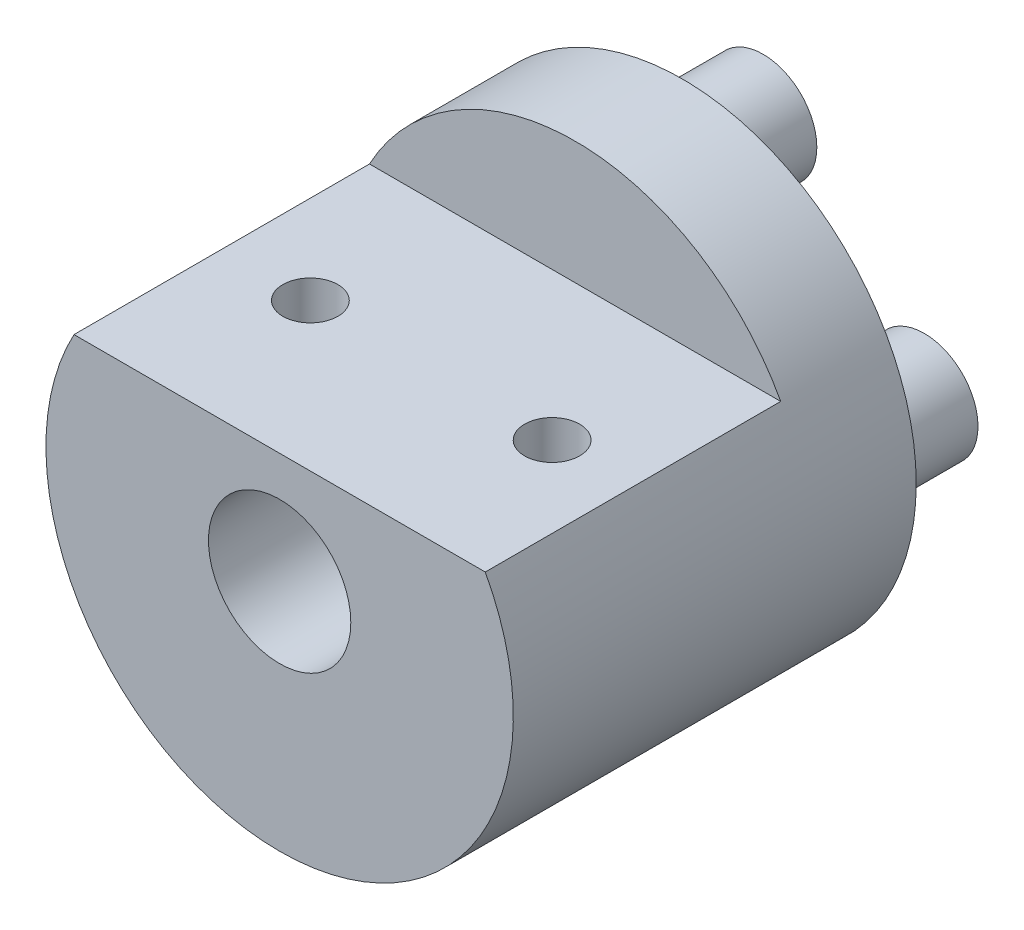
ISO-10303-21;
HEADER;
FILE_DESCRIPTION(('STEP AP214'),'2;1');
FILE_NAME('part.step','',(''),(''),'','','');
FILE_SCHEMA(('AUTOMOTIVE_DESIGN { 1 0 10303 214 1 1 1 1 }'));
ENDSEC;
DATA;
#1=APPLICATION_CONTEXT('core data for automotive mechanical design processes');
#2=APPLICATION_PROTOCOL_DEFINITION('international standard','automotive_design',2000,#1);
#3=PRODUCT_CONTEXT('',#1,'mechanical');
#4=PRODUCT('Part','Part','',(#3));
#5=PRODUCT_RELATED_PRODUCT_CATEGORY('part','',(#4));
#6=PRODUCT_DEFINITION_FORMATION('','',#4);
#7=PRODUCT_DEFINITION_CONTEXT('part definition',#1,'design');
#8=PRODUCT_DEFINITION('design','',#6,#7);
#9=PRODUCT_DEFINITION_SHAPE('','',#8);
#10=(LENGTH_UNIT() NAMED_UNIT(*) SI_UNIT(.MILLI.,.METRE.));
#11=(NAMED_UNIT(*) PLANE_ANGLE_UNIT() SI_UNIT($,.RADIAN.));
#12=(NAMED_UNIT(*) SI_UNIT($,.STERADIAN.) SOLID_ANGLE_UNIT());
#13=UNCERTAINTY_MEASURE_WITH_UNIT(LENGTH_MEASURE(1.E-05),#10,'distance_accuracy_value','');
#14=(GEOMETRIC_REPRESENTATION_CONTEXT(3) GLOBAL_UNCERTAINTY_ASSIGNED_CONTEXT((#13)) GLOBAL_UNIT_ASSIGNED_CONTEXT((#10,
#11,#12)) REPRESENTATION_CONTEXT('',''));
#15=CARTESIAN_POINT('',(0.,0.,0.));
#16=DIRECTION('',(0.,0.,1.));
#17=DIRECTION('',(1.,0.,0.));
#18=AXIS2_PLACEMENT_3D('',#15,#16,#17);
#19=CARTESIAN_POINT('',(0.,0.,15.));
#20=DIRECTION('',(0.,0.,-1.));
#21=DIRECTION('',(-1.,0.,0.));
#22=AXIS2_PLACEMENT_3D('',#19,#20,#21);
#23=CYLINDRICAL_SURFACE('',#22,1.75);
#24=CARTESIAN_POINT('',(0.,0.,8.3));
#25=DIRECTION('',(0.,0.,1.));
#26=DIRECTION('',(1.,0.,0.));
#27=AXIS2_PLACEMENT_3D('',#24,#25,#26);
#28=CIRCLE('',#27,1.75);
#29=CARTESIAN_POINT('',(1.75,0.,8.3));
#30=VERTEX_POINT('',#29);
#31=EDGE_CURVE('E94',#30,#30,#28,.T.);
#32=ORIENTED_EDGE('',*,*,#31,.T.);
#33=EDGE_LOOP('',(#32));
#34=FACE_BOUND('',#33,.T.);
#35=CARTESIAN_POINT('',(0.,0.,0.));
#36=DIRECTION('',(0.,0.,-1.));
#37=DIRECTION('',(-1.,0.,0.));
#38=AXIS2_PLACEMENT_3D('',#35,#36,#37);
#39=CIRCLE('',#38,1.75);
#40=CARTESIAN_POINT('',(-1.75,0.,0.));
#41=VERTEX_POINT('',#40);
#42=EDGE_CURVE('E83',#41,#41,#39,.T.);
#43=ORIENTED_EDGE('',*,*,#42,.T.);
#44=EDGE_LOOP('',(#43));
#45=FACE_BOUND('',#44,.T.);
#46=ADVANCED_FACE('F33',(#34,#45),#23,.F.);
#47=CARTESIAN_POINT('',(0.,0.,15.));
#48=DIRECTION('',(0.,0.,-1.));
#49=DIRECTION('',(-1.,0.,0.));
#50=AXIS2_PLACEMENT_3D('',#47,#48,#49);
#51=CYLINDRICAL_SURFACE('',#50,8.7);
#52=CARTESIAN_POINT('',(-4.35554645653572,-7.53121604158048,10.525));
#53=CARTESIAN_POINT('',(-4.29400428038766,-7.56680795887507,10.5249993342608));
#54=CARTESIAN_POINT('',(-4.23201650551024,-7.60164240081337,10.5194560856518));
#55=CARTESIAN_POINT('',(-4.10882775341196,-7.6689278914294,10.4968315762793));
#56=CARTESIAN_POINT('',(-4.04762661929849,-7.70137942165169,10.4797526538265));
#57=CARTESIAN_POINT('',(-3.92772718640544,-7.76321665446499,10.4336704729739));
#58=CARTESIAN_POINT('',(-3.86904373645899,-7.79258534309199,10.4046050000717));
#59=CARTESIAN_POINT('',(-3.7569935006844,-7.84722143526912,10.33469203926));
#60=CARTESIAN_POINT('',(-3.70362372425557,-7.87249115086864,10.2938512296611));
#61=CARTESIAN_POINT('',(-3.60994323413651,-7.91585159217477,10.2059715796399));
#62=CARTESIAN_POINT('',(-3.56885512382942,-7.93441225926918,10.1599941045405));
#63=CARTESIAN_POINT('',(-3.49506956632667,-7.96719042664165,10.0603897927461));
#64=CARTESIAN_POINT('',(-3.46236609477792,-7.98141104664498,10.0067684914785));
#65=CARTESIAN_POINT('',(-3.40986146633821,-8.00397279938928,9.89938508818708));
#66=CARTESIAN_POINT('',(-3.38908617804231,-8.01276489614381,9.84619228391827));
#67=CARTESIAN_POINT('',(-3.35660164369548,-8.02642759664717,9.73663087137235));
#68=CARTESIAN_POINT('',(-3.34488872806173,-8.0312997876964,9.68026355846311));
#69=CARTESIAN_POINT('',(-3.33147312958303,-8.03687349496063,9.56949713887236));
#70=CARTESIAN_POINT('',(-3.32922754748633,-8.03780123206871,9.51517440060492));
#71=CARTESIAN_POINT('',(-3.33334630447946,-8.03609405425717,9.40691759770505));
#72=CARTESIAN_POINT('',(-3.33970930018121,-8.03345969521075,9.35298347374881));
#73=CARTESIAN_POINT('',(-3.36060616695197,-8.02473985388008,9.24792408459675));
#74=CARTESIAN_POINT('',(-3.37500763794755,-8.01871027964305,9.19676767999466));
#75=CARTESIAN_POINT('',(-3.41130942560675,-8.00333393197255,9.09772687767826));
#76=CARTESIAN_POINT('',(-3.43320999119779,-7.99398704842285,9.04984258864294));
#77=CARTESIAN_POINT('',(-3.48420000972968,-7.97189654934941,8.95758359599997));
#78=CARTESIAN_POINT('',(-3.51342881708616,-7.95908666071719,8.91330199635763));
#79=CARTESIAN_POINT('',(-3.57774771732606,-7.9303820327362,8.83036567223915));
#80=CARTESIAN_POINT('',(-3.61283891929251,-7.91448670957408,8.79171201508558));
#81=CARTESIAN_POINT('',(-3.68980769941174,-7.87890929137596,8.71872851795803));
#82=CARTESIAN_POINT('',(-3.73195598439553,-7.85906448145331,8.68476420728456));
#83=CARTESIAN_POINT('',(-3.82006727091189,-7.81661555971276,8.62436101004462));
#84=CARTESIAN_POINT('',(-3.86603153392832,-7.79401053425238,8.59792462495247));
#85=CARTESIAN_POINT('',(-3.96470537082819,-7.74431566728342,8.55072577693883));
#86=CARTESIAN_POINT('',(-4.01764975983226,-7.71700530604508,8.53068777601717));
#87=CARTESIAN_POINT('',(-4.12498112225461,-7.66017136341189,8.49970542995394));
#88=CARTESIAN_POINT('',(-4.17936873151814,-7.63064679567203,8.48876516405611));
#89=CARTESIAN_POINT('',(-4.29436652076138,-7.56658511231489,8.47501320121025));
#90=CARTESIAN_POINT('',(-4.35499456004738,-7.53185610041308,8.47324348841266));
#91=CARTESIAN_POINT('',(-4.47494238072689,-7.46121608743635,8.48020426429827));
#92=CARTESIAN_POINT('',(-4.53426158579555,-7.42530458235648,8.48893928818532));
#93=CARTESIAN_POINT('',(-4.65599897262735,-7.34964563657211,8.51783912366334));
#94=CARTESIAN_POINT('',(-4.71815426172329,-7.30986600234233,8.53903660988008));
#95=CARTESIAN_POINT('',(-4.83786001754329,-7.23119967774362,8.59318184701488));
#96=CARTESIAN_POINT('',(-4.89540544158341,-7.19231399752878,8.62614225602992));
#97=CARTESIAN_POINT('',(-5.00511863645393,-7.11641146058272,8.70420058950506));
#98=CARTESIAN_POINT('',(-5.05717446419203,-7.07943930915504,8.74950113961752));
#99=CARTESIAN_POINT('',(-5.15246031512338,-7.01039240441176,8.85161630883809));
#100=CARTESIAN_POINT('',(-5.19571327596723,-6.97830497946207,8.90840021461701));
#101=CARTESIAN_POINT('',(-5.25795574761008,-6.93144127943437,9.01154278520135));
#102=CARTESIAN_POINT('',(-5.28020770185791,-6.91447717479443,9.05495369082748));
#103=CARTESIAN_POINT('',(-5.31865564537531,-6.88494657213648,9.14578239779058));
#104=CARTESIAN_POINT('',(-5.33485728937619,-6.8723759685794,9.19319640666933));
#105=CARTESIAN_POINT('',(-5.36036024273163,-6.85250370417936,9.2912945387505));
#106=CARTESIAN_POINT('',(-5.36961398432916,-6.84523837420239,9.34199866806906));
#107=CARTESIAN_POINT('',(-5.3803541816674,-6.83680037833963,9.44472285691333));
#108=CARTESIAN_POINT('',(-5.38184460734218,-6.8356245984367,9.49674223018273));
#109=CARTESIAN_POINT('',(-5.37722204400399,-6.83926063199996,9.59454731992084));
#110=CARTESIAN_POINT('',(-5.37191421013725,-6.84343842036687,9.64039857378575));
#111=CARTESIAN_POINT('',(-5.35537655575865,-6.85638759426895,9.73033882443349));
#112=CARTESIAN_POINT('',(-5.3441460281097,-6.865159528319,9.77442761011096));
#113=CARTESIAN_POINT('',(-5.3161342998375,-6.88687389623165,9.86052830810605));
#114=CARTESIAN_POINT('',(-5.29926596350768,-6.89988171157331,9.9024948947835));
#115=CARTESIAN_POINT('',(-5.26076928127915,-6.92927790238886,9.98289330023698));
#116=CARTESIAN_POINT('',(-5.23913910745362,-6.94566757590489,10.0213237535424));
#117=CARTESIAN_POINT('',(-5.18820738652277,-6.98381427326492,10.0998443715484));
#118=CARTESIAN_POINT('',(-5.15823826555677,-7.00600890058962,10.139286978872));
#119=CARTESIAN_POINT('',(-5.09388012285587,-7.05294086651045,10.2126525496323));
#120=CARTESIAN_POINT('',(-5.05948828812009,-7.07767982136523,10.2465719687401));
#121=CARTESIAN_POINT('',(-4.97975484263507,-7.13406444014185,10.3150328176498));
#122=CARTESIAN_POINT('',(-4.93360454744194,-7.16609597262648,10.3483165306307));
#123=CARTESIAN_POINT('',(-4.83718646398712,-7.23153032563,10.4065452719105));
#124=CARTESIAN_POINT('',(-4.78691550629087,-7.26493419164958,10.4314838050951));
#125=CARTESIAN_POINT('',(-4.67500389136192,-7.33753732122953,10.4760899094964));
#126=CARTESIAN_POINT('',(-4.61282501491254,-7.37681496953814,10.4942927602742));
#127=CARTESIAN_POINT('',(-4.48578050510063,-7.45475196019621,10.5187482180313));
#128=CARTESIAN_POINT('',(-4.4209148452415,-7.49341129644278,10.5250007071296));
#129=CARTESIAN_POINT('',(-4.35554645653572,-7.53121604158048,10.525));
#130=B_SPLINE_CURVE_WITH_KNOTS('',3,(#52,#53,#54,#55,#56,#57,#58,#59,#60,#61,#62,#63,#64,#65,
#66,#67,#68,#69,#70,#71,#72,#73,#74,#75,#76,#77,#78,#79,#80,#81,#82,#83,#84,#85,#86,#87,#88,#89,
#90,#91,#92,#93,#94,#95,#96,#97,#98,#99,#100,#101,#102,#103,#104,#105,#106,#107,#108,#109,#110,
#111,#112,#113,#114,#115,#116,#117,#118,#119,#120,#121,#122,#123,#124,#125,#126,#127,#128,#129),
.UNSPECIFIED.,.T.,.F.,(4,2,2,2,2,2,2,2,2,2,2,2,2,2,2,2,2,2,2,2,2,2,2,2,2,2,2,2,2,2,2,2,2,2,2,2,
2,2,4),(0.,0.213045968187149,0.426048764365991,0.640171320999957,0.854172677399156,
1.04628322642857,1.23825535496514,1.41069733148464,1.58306944530965,1.74540993748608,
1.90772509898274,2.06744249803457,2.22716519931253,2.39019234578984,2.55325036972172,
2.72548063306795,2.89776806065712,3.08555597727527,3.27342804893546,3.48224139603766,
3.69114492637777,3.92044463974753,4.14999185057976,4.38356268477468,4.61651688281921,
4.77086376557371,4.92506602969671,5.08031462383675,5.23548382055917,5.37386553346146,
5.5122637721217,5.65290838899227,5.79360708955357,5.95585878903524,6.11821420146931,
6.31335690448244,6.50865113713579,6.73494040996452,6.96123191495047),.UNSPECIFIED.);
#131=CARTESIAN_POINT('',(-4.35554645653572,-7.53121604158048,10.525));
#132=VERTEX_POINT('',#131);
#133=EDGE_CURVE('E105',#132,#132,#130,.T.);
#134=ORIENTED_EDGE('',*,*,#133,.T.);
#135=EDGE_LOOP('',(#134));
#136=FACE_BOUND('',#135,.T.);
#137=CARTESIAN_POINT('',(4.64445354346428,-7.35656518237976,10.525));
#138=CARTESIAN_POINT('',(4.71815393182572,-7.31003303115343,10.5249987797796));
#139=CARTESIAN_POINT('',(4.79120086093062,-7.26235113807829,10.5170490581823));
#140=CARTESIAN_POINT('',(4.93371045265028,-7.16630437975942,10.4860486364902));
#141=CARTESIAN_POINT('',(5.00316524240529,-7.11793828760546,10.4629661673902));
#142=CARTESIAN_POINT('',(5.13234537040392,-7.02530915044312,10.4040585753655));
#143=CARTESIAN_POINT('',(5.19240427455238,-6.98097384244621,10.3690792961992));
#144=CARTESIAN_POINT('',(5.30553479046785,-6.8953828658052,10.2864392723338));
#145=CARTESIAN_POINT('',(5.35862076745976,-6.8541209440096,10.2388052306372));
#146=CARTESIAN_POINT('',(5.44111107783712,-6.78868339315813,10.1469672172265));
#147=CARTESIAN_POINT('',(5.47287870889877,-6.76306095657114,10.1059063340448));
#148=CARTESIAN_POINT('',(5.53062049286008,-6.71592288239306,10.0177813027307));
#149=CARTESIAN_POINT('',(5.55660300930146,-6.6944013227447,9.97072597765441));
#150=CARTESIAN_POINT('',(5.59755819733306,-6.6601750756637,9.87981197172478));
#151=CARTESIAN_POINT('',(5.61365573407518,-6.64659069016058,9.83679454213344));
#152=CARTESIAN_POINT('',(5.64011710526801,-6.62415144736011,9.7478443046384));
#153=CARTESIAN_POINT('',(5.65048466506954,-6.61529351728231,9.70191341263379));
#154=CARTESIAN_POINT('',(5.66484680246569,-6.60299963344695,9.60809347133757));
#155=CARTESIAN_POINT('',(5.66880906823867,-6.59959117073903,9.5601957361293));
#156=CARTESIAN_POINT('',(5.66995213655247,-6.59860924979251,9.46426026280696));
#157=CARTESIAN_POINT('',(5.6671339358747,-6.60103493388885,9.41622254630816));
#158=CARTESIAN_POINT('',(5.65544788493367,-6.61104825335389,9.32554920880798));
#159=CARTESIAN_POINT('',(5.64709802675579,-6.61819376158997,9.282794761153));
#160=CARTESIAN_POINT('',(5.62537349968405,-6.63666895692325,9.19954500779574));
#161=CARTESIAN_POINT('',(5.61199797159353,-6.64799935947114,9.15905008974665));
#162=CARTESIAN_POINT('',(5.57970995690913,-6.67512622823768,9.0781533636793));
#163=CARTESIAN_POINT('',(5.56046348613067,-6.69118917236125,9.03797593912551));
#164=CARTESIAN_POINT('',(5.51769770025128,-6.72649858416267,8.96148931720486));
#165=CARTESIAN_POINT('',(5.49417498254176,-6.74574758588595,8.92518323702861));
#166=CARTESIAN_POINT('',(5.4314223101847,-6.79646631793209,8.84024784679849));
#167=CARTESIAN_POINT('',(5.39006378889856,-6.82937497625125,8.79403963902011));
#168=CARTESIAN_POINT('',(5.30131985403172,-6.89849142146871,8.71078159565324));
#169=CARTESIAN_POINT('',(5.25392507938524,-6.93470430731019,8.67374625385326));
#170=CARTESIAN_POINT('',(5.15383921261313,-7.00941427412087,8.60850549245737));
#171=CARTESIAN_POINT('',(5.10108760394258,-7.04793482185946,8.58042033658029));
#172=CARTESIAN_POINT('',(4.99198174042232,-7.12563040394744,8.53389064775107));
#173=CARTESIAN_POINT('',(4.93562791407123,-7.16480536004426,8.51544497052955));
#174=CARTESIAN_POINT('',(4.81169244339805,-7.24872478284551,8.48644699165651));
#175=CARTESIAN_POINT('',(4.74369588773675,-7.29342182496608,8.47749679271112));
#176=CARTESIAN_POINT('',(4.60610927787613,-7.38108475497538,8.47340793758304));
#177=CARTESIAN_POINT('',(4.5365185206067,-7.42404985506514,8.47827549628819));
#178=CARTESIAN_POINT('',(4.3992385203194,-7.50619623345104,8.50237147058542));
#179=CARTESIAN_POINT('',(4.33153746812218,-7.54543120611925,8.52134300808966));
#180=CARTESIAN_POINT('',(4.19953977195899,-7.61968406373473,8.57387512745824));
#181=CARTESIAN_POINT('',(4.13523984654594,-7.65470605658775,8.60742134847309));
#182=CARTESIAN_POINT('',(4.0208662634321,-7.7153297110385,8.68397049940753));
#183=CARTESIAN_POINT('',(3.9700149693819,-7.74155991283555,8.72530949810749));
#184=CARTESIAN_POINT('',(3.87608187882106,-7.78901522999145,8.81839429390572));
#185=CARTESIAN_POINT('',(3.83299160455978,-7.8102458145767,8.87012860333007));
#186=CARTESIAN_POINT('',(3.76237881265611,-7.84447803418724,8.97465745681648));
#187=CARTESIAN_POINT('',(3.73352796025877,-7.85821133312875,9.02631796846594));
#188=CARTESIAN_POINT('',(3.68492834834605,-7.8811185766332,9.13468626517447));
#189=CARTESIAN_POINT('',(3.66517350201494,-7.8902955704824,9.19139064459958));
#190=CARTESIAN_POINT('',(3.63720273064806,-7.90322536669725,9.30242147139453));
#191=CARTESIAN_POINT('',(3.62807689304229,-7.9074068642865,9.35647060788105));
#192=CARTESIAN_POINT('',(3.61857630760304,-7.91175927682302,9.46548707743912));
#193=CARTESIAN_POINT('',(3.61819886176706,-7.91193142825204,9.52045412219445));
#194=CARTESIAN_POINT('',(3.62604964841011,-7.90833607113019,9.62745049894645));
#195=CARTESIAN_POINT('',(3.63394005588869,-7.90472321909037,9.67951035395196));
#196=CARTESIAN_POINT('',(3.65746436780409,-7.89386600709286,9.78144854918985));
#197=CARTESIAN_POINT('',(3.67309800411339,-7.88662177288022,9.8313269648946));
#198=CARTESIAN_POINT('',(3.71161701593956,-7.86856734215734,9.92798374808597));
#199=CARTESIAN_POINT('',(3.73456039829486,-7.8577285920322,9.97473356867489));
#200=CARTESIAN_POINT('',(3.78674726657341,-7.83271216068327,10.0635786597096));
#201=CARTESIAN_POINT('',(3.81599163147017,-7.81853401359505,10.1056732795238));
#202=CARTESIAN_POINT('',(3.88134641498917,-7.786304655176,10.1863850122854));
#203=CARTESIAN_POINT('',(3.91773086215512,-7.7680928421786,10.2247154355401));
#204=CARTESIAN_POINT('',(3.99499359395253,-7.72864202947403,10.294699375893));
#205=CARTESIAN_POINT('',(4.03587379790424,-7.70740173569705,10.3263500243103));
#206=CARTESIAN_POINT('',(4.12474776900222,-7.6602354988867,10.3852262756241));
#207=CARTESIAN_POINT('',(4.17305021149036,-7.63405874433184,10.4117832277125));
#208=CARTESIAN_POINT('',(4.271991043954,-7.57913546971955,10.4564754425296));
#209=CARTESIAN_POINT('',(4.32262929865055,-7.55038909839168,10.474611192302));
#210=CARTESIAN_POINT('',(4.41856092830397,-7.49459834866594,10.5008760721198));
#211=CARTESIAN_POINT('',(4.46373187065483,-7.46778987313824,10.5099721491783));
#212=CARTESIAN_POINT('',(4.55416765393656,-7.41298591876853,10.5220354547143));
#213=CARTESIAN_POINT('',(4.59943252003069,-7.38499006747672,10.5250007453905));
#214=CARTESIAN_POINT('',(4.64445354346428,-7.35656518237976,10.525));
#215=B_SPLINE_CURVE_WITH_KNOTS('',3,(#137,#138,#139,#140,#141,#142,#143,#144,#145,#146,#147,
#148,#149,#150,#151,#152,#153,#154,#155,#156,#157,#158,#159,#160,#161,#162,#163,#164,#165,#166,
#167,#168,#169,#170,#171,#172,#173,#174,#175,#176,#177,#178,#179,#180,#181,#182,#183,#184,#185,
#186,#187,#188,#189,#190,#191,#192,#193,#194,#195,#196,#197,#198,#199,#200,#201,#202,#203,#204,
#205,#206,#207,#208,#209,#210,#211,#212,#213,#214),.UNSPECIFIED.,.T.,.F.,(4,2,2,2,2,2,2,2,2,2,2,
2,2,2,2,2,2,2,2,2,2,2,2,2,2,2,2,2,2,2,2,2,2,2,2,2,2,2,4),(0.,0.261263380499853,
0.523077009480396,0.76921241420961,1.0148325143346,1.18789912579184,1.36071388635489,
1.50381795710059,1.64682887879993,1.79055899999154,1.93426799302658,2.06612728963617,
2.19800913938953,2.33955757349703,2.48121913459888,2.69069762179205,2.90050501825504,
3.11302310372105,3.325515956162,3.56993128448406,3.81445656223009,4.05463412537288,
4.29457556955478,4.50509593859627,4.71538493225158,4.89661990149859,5.07773341602851,
5.24182670869693,5.40586939434878,5.56346128494191,5.72104771892641,5.87991721186797,
6.03880888112733,6.20580093240574,6.37286455442908,6.55519441095419,6.73751372104104,
6.89706008126184,7.05665686273518),.UNSPECIFIED.);
#216=CARTESIAN_POINT('',(4.64445354346428,-7.35656518237976,10.525));
#217=VERTEX_POINT('',#216);
#218=EDGE_CURVE('E98',#217,#217,#215,.T.);
#219=ORIENTED_EDGE('',*,*,#218,.T.);
#220=EDGE_LOOP('',(#219));
#221=FACE_BOUND('',#220,.T.);
#222=CARTESIAN_POINT('',(0.,0.,15.));
#223=DIRECTION('',(0.,0.,1.));
#224=DIRECTION('',(1.,0.,0.));
#225=AXIS2_PLACEMENT_3D('',#222,#223,#224);
#226=CIRCLE('',#225,8.7);
#227=CARTESIAN_POINT('',(-7.65554645653572,4.1331112314845,15.));
#228=VERTEX_POINT('',#227);
#229=CARTESIAN_POINT('',(7.65554645653572,4.1331112314845,15.));
#230=VERTEX_POINT('',#229);
#231=EDGE_CURVE('E65',#228,#230,#226,.T.);
#232=ORIENTED_EDGE('',*,*,#231,.F.);
#233=DIRECTION('',(0.,0.,1.));
#234=VECTOR('',#233,1.);
#235=CARTESIAN_POINT('',(-7.65554645653572,4.1331112314845,4.));
#236=LINE('',#235,#234);
#237=CARTESIAN_POINT('',(-7.65554645653572,4.1331112314845,4.));
#238=VERTEX_POINT('',#237);
#239=EDGE_CURVE('E48',#238,#228,#236,.T.);
#240=ORIENTED_EDGE('',*,*,#239,.F.);
#241=CARTESIAN_POINT('',(0.,0.,4.));
#242=DIRECTION('',(0.,0.,1.));
#243=DIRECTION('',(1.,0.,0.));
#244=AXIS2_PLACEMENT_3D('',#241,#242,#243);
#245=CIRCLE('',#244,8.7);
#246=CARTESIAN_POINT('',(7.65554645653572,4.1331112314845,4.));
#247=VERTEX_POINT('',#246);
#248=EDGE_CURVE('E55',#247,#238,#245,.T.);
#249=ORIENTED_EDGE('',*,*,#248,.F.);
#250=DIRECTION('',(0.,0.,-1.));
#251=VECTOR('',#250,1.);
#252=CARTESIAN_POINT('',(7.65554645653572,4.1331112314845,15.));
#253=LINE('',#252,#251);
#254=EDGE_CURVE('E68',#247,#230,#253,.F.);
#255=ORIENTED_EDGE('',*,*,#254,.T.);
#256=EDGE_LOOP('',(#232,#240,#249,#255));
#257=FACE_BOUND('',#256,.T.);
#258=CARTESIAN_POINT('',(0.,0.,0.));
#259=DIRECTION('',(0.,0.,1.));
#260=DIRECTION('',(1.,0.,0.));
#261=AXIS2_PLACEMENT_3D('',#258,#259,#260);
#262=CIRCLE('',#261,8.7);
#263=CARTESIAN_POINT('',(8.7,0.,0.));
#264=VERTEX_POINT('',#263);
#265=EDGE_CURVE('E88',#264,#264,#262,.T.);
#266=ORIENTED_EDGE('',*,*,#265,.T.);
#267=EDGE_LOOP('',(#266));
#268=FACE_BOUND('',#267,.T.);
#269=ADVANCED_FACE('F72',(#136,#221,#257,#268),#51,.T.);
#270=CARTESIAN_POINT('',(0.,0.,15.));
#271=DIRECTION('',(0.,0.,1.));
#272=DIRECTION('',(1.,0.,0.));
#273=AXIS2_PLACEMENT_3D('',#270,#271,#272);
#274=PLANE('',#273);
#275=DIRECTION('',(1.,0.,0.));
#276=VECTOR('',#275,1.);
#277=CARTESIAN_POINT('',(-7.65554645653572,4.1331112314845,15.));
#278=LINE('',#277,#276);
#279=EDGE_CURVE('E69',#228,#230,#278,.T.);
#280=ORIENTED_EDGE('',*,*,#279,.F.);
#281=ORIENTED_EDGE('',*,*,#231,.T.);
#282=EDGE_LOOP('',(#280,#281));
#283=FACE_BOUND('',#282,.T.);
#284=CARTESIAN_POINT('',(0.,0.,15.));
#285=DIRECTION('',(0.,0.,1.));
#286=DIRECTION('',(1.,0.,0.));
#287=AXIS2_PLACEMENT_3D('',#284,#285,#286);
#288=CIRCLE('',#287,2.65);
#289=CARTESIAN_POINT('',(2.65,0.,15.));
#290=VERTEX_POINT('',#289);
#291=EDGE_CURVE('E76',#290,#290,#288,.T.);
#292=ORIENTED_EDGE('',*,*,#291,.F.);
#293=EDGE_LOOP('',(#292));
#294=FACE_BOUND('',#293,.T.);
#295=ADVANCED_FACE('F137',(#283,#294),#274,.T.);
#296=CARTESIAN_POINT('',(0.,0.,0.));
#297=DIRECTION('',(0.,0.,1.));
#298=DIRECTION('',(1.,0.,0.));
#299=AXIS2_PLACEMENT_3D('',#296,#297,#298);
#300=PLANE('',#299);
#301=CARTESIAN_POINT('',(6.,0.,0.));
#302=DIRECTION('',(0.,0.,1.));
#303=DIRECTION('',(1.,0.,0.));
#304=AXIS2_PLACEMENT_3D('',#301,#302,#303);
#305=CIRCLE('',#304,2.);
#306=CARTESIAN_POINT('',(8.,0.,0.));
#307=VERTEX_POINT('',#306);
#308=EDGE_CURVE('E11',#307,#307,#305,.F.);
#309=ORIENTED_EDGE('',*,*,#308,.F.);
#310=EDGE_LOOP('',(#309));
#311=FACE_BOUND('',#310,.T.);
#312=CARTESIAN_POINT('',(0.,-6.,0.));
#313=DIRECTION('',(0.,0.,1.));
#314=DIRECTION('',(1.,0.,0.));
#315=AXIS2_PLACEMENT_3D('',#312,#313,#314);
#316=CIRCLE('',#315,2.);
#317=CARTESIAN_POINT('',(2.,-6.,0.));
#318=VERTEX_POINT('',#317);
#319=EDGE_CURVE('E41',#318,#318,#316,.F.);
#320=ORIENTED_EDGE('',*,*,#319,.F.);
#321=EDGE_LOOP('',(#320));
#322=FACE_BOUND('',#321,.T.);
#323=CARTESIAN_POINT('',(-6.,0.,0.));
#324=DIRECTION('',(0.,0.,1.));
#325=DIRECTION('',(1.,0.,0.));
#326=AXIS2_PLACEMENT_3D('',#323,#324,#325);
#327=CIRCLE('',#326,2.);
#328=CARTESIAN_POINT('',(-4.,0.,0.));
#329=VERTEX_POINT('',#328);
#330=EDGE_CURVE('E152',#329,#329,#327,.F.);
#331=ORIENTED_EDGE('',*,*,#330,.F.);
#332=EDGE_LOOP('',(#331));
#333=FACE_BOUND('',#332,.T.);
#334=CARTESIAN_POINT('',(0.,6.,0.));
#335=DIRECTION('',(0.,0.,1.));
#336=DIRECTION('',(1.,0.,0.));
#337=AXIS2_PLACEMENT_3D('',#334,#335,#336);
#338=CIRCLE('',#337,2.);
#339=CARTESIAN_POINT('',(2.,6.,0.));
#340=VERTEX_POINT('',#339);
#341=EDGE_CURVE('E97',#340,#340,#338,.F.);
#342=ORIENTED_EDGE('',*,*,#341,.F.);
#343=EDGE_LOOP('',(#342));
#344=FACE_BOUND('',#343,.T.);
#345=ORIENTED_EDGE('',*,*,#42,.F.);
#346=EDGE_LOOP('',(#345));
#347=FACE_BOUND('',#346,.T.);
#348=ORIENTED_EDGE('',*,*,#265,.F.);
#349=EDGE_LOOP('',(#348));
#350=FACE_BOUND('',#349,.T.);
#351=ADVANCED_FACE('F129',(#311,#322,#333,#344,#347,#350),#300,.F.);
#352=CARTESIAN_POINT('',(0.,0.,8.6));
#353=DIRECTION('',(0.,0.,1.));
#354=DIRECTION('',(1.,0.,0.));
#355=AXIS2_PLACEMENT_3D('',#352,#353,#354);
#356=PLANE('',#355);
#357=CARTESIAN_POINT('',(0.,0.,8.6));
#358=DIRECTION('',(0.,0.,1.));
#359=DIRECTION('',(1.,0.,0.));
#360=AXIS2_PLACEMENT_3D('',#357,#358,#359);
#361=CIRCLE('',#360,2.05);
#362=CARTESIAN_POINT('',(2.05,0.,8.6));
#363=VERTEX_POINT('',#362);
#364=EDGE_CURVE('E64',#363,#363,#361,.F.);
#365=ORIENTED_EDGE('',*,*,#364,.T.);
#366=EDGE_LOOP('',(#365));
#367=FACE_BOUND('',#366,.T.);
#368=CARTESIAN_POINT('',(0.,0.,8.6));
#369=DIRECTION('',(0.,0.,1.));
#370=DIRECTION('',(1.,0.,0.));
#371=AXIS2_PLACEMENT_3D('',#368,#369,#370);
#372=CIRCLE('',#371,2.65);
#373=CARTESIAN_POINT('',(2.65,0.,8.6));
#374=VERTEX_POINT('',#373);
#375=EDGE_CURVE('E80',#374,#374,#372,.T.);
#376=ORIENTED_EDGE('',*,*,#375,.T.);
#377=EDGE_LOOP('',(#376));
#378=FACE_BOUND('',#377,.T.);
#379=ADVANCED_FACE('F126',(#367,#378),#356,.T.);
#380=CARTESIAN_POINT('',(0.,0.,8.6));
#381=DIRECTION('',(0.,0.,1.));
#382=DIRECTION('',(1.,0.,0.));
#383=AXIS2_PLACEMENT_3D('',#380,#381,#382);
#384=CYLINDRICAL_SURFACE('',#383,2.65);
#385=ORIENTED_EDGE('',*,*,#375,.F.);
#386=EDGE_LOOP('',(#385));
#387=FACE_BOUND('',#386,.T.);
#388=ORIENTED_EDGE('',*,*,#291,.T.);
#389=EDGE_LOOP('',(#388));
#390=FACE_BOUND('',#389,.T.);
#391=ADVANCED_FACE('F122',(#387,#390),#384,.F.);
#392=CARTESIAN_POINT('',(0.,0.,4.));
#393=DIRECTION('',(0.,0.,1.));
#394=DIRECTION('',(1.,0.,0.));
#395=AXIS2_PLACEMENT_3D('',#392,#393,#394);
#396=PLANE('',#395);
#397=DIRECTION('',(1.,0.,0.));
#398=VECTOR('',#397,1.);
#399=CARTESIAN_POINT('',(-7.65554645653572,4.1331112314845,4.));
#400=LINE('',#399,#398);
#401=EDGE_CURVE('E63',#238,#247,#400,.T.);
#402=ORIENTED_EDGE('',*,*,#401,.T.);
#403=ORIENTED_EDGE('',*,*,#248,.T.);
#404=EDGE_LOOP('',(#402,#403));
#405=FACE_BOUND('',#404,.T.);
#406=ADVANCED_FACE('F62',(#405),#396,.T.);
#407=CARTESIAN_POINT('',(-7.65554645653572,4.1331112314845,4.));
#408=DIRECTION('',(0.,-1.,0.));
#409=DIRECTION('',(0.,0.,-1.));
#410=AXIS2_PLACEMENT_3D('',#407,#408,#409);
#411=PLANE('',#410);
#412=CARTESIAN_POINT('',(-4.35554645653572,4.1331112314845,9.5));
#413=DIRECTION('',(0.,1.,0.));
#414=DIRECTION('',(0.,0.,1.));
#415=AXIS2_PLACEMENT_3D('',#412,#413,#414);
#416=CIRCLE('',#415,1.02499999999999);
#417=CARTESIAN_POINT('',(-4.35554645653572,4.1331112314845,10.525));
#418=VERTEX_POINT('',#417);
#419=EDGE_CURVE('E169',#418,#418,#416,.T.);
#420=ORIENTED_EDGE('',*,*,#419,.F.);
#421=EDGE_LOOP('',(#420));
#422=FACE_BOUND('',#421,.T.);
#423=CARTESIAN_POINT('',(4.64445354346428,4.1331112314845,9.5));
#424=DIRECTION('',(0.,1.,0.));
#425=DIRECTION('',(0.,0.,1.));
#426=AXIS2_PLACEMENT_3D('',#423,#424,#425);
#427=CIRCLE('',#426,1.02499999999999);
#428=CARTESIAN_POINT('',(4.64445354346428,4.1331112314845,10.525));
#429=VERTEX_POINT('',#428);
#430=EDGE_CURVE('E104',#429,#429,#427,.T.);
#431=ORIENTED_EDGE('',*,*,#430,.F.);
#432=EDGE_LOOP('',(#431));
#433=FACE_BOUND('',#432,.T.);
#434=ORIENTED_EDGE('',*,*,#401,.F.);
#435=ORIENTED_EDGE('',*,*,#239,.T.);
#436=ORIENTED_EDGE('',*,*,#279,.T.);
#437=ORIENTED_EDGE('',*,*,#254,.F.);
#438=EDGE_LOOP('',(#434,#435,#436,#437));
#439=FACE_BOUND('',#438,.T.);
#440=ADVANCED_FACE('F67',(#422,#433,#439),#411,.F.);
#441=CARTESIAN_POINT('',(0.,0.,8.3));
#442=DIRECTION('',(0.,0.,1.));
#443=DIRECTION('',(1.,0.,0.));
#444=AXIS2_PLACEMENT_3D('',#441,#442,#443);
#445=TOROIDAL_SURFACE('',#444,2.05,0.3);
#446=ORIENTED_EDGE('',*,*,#31,.F.);
#447=EDGE_LOOP('',(#446));
#448=FACE_BOUND('',#447,.T.);
#449=ORIENTED_EDGE('',*,*,#364,.F.);
#450=EDGE_LOOP('',(#449));
#451=FACE_BOUND('',#450,.T.);
#452=ADVANCED_FACE('F35',(#448,#451),#445,.T.);
#453=CARTESIAN_POINT('',(4.64445354346428,4.1331112314845,9.5));
#454=DIRECTION('',(0.,1.,0.));
#455=DIRECTION('',(0.,0.,1.));
#456=AXIS2_PLACEMENT_3D('',#453,#454,#455);
#457=CYLINDRICAL_SURFACE('',#456,1.02499999999999);
#458=ORIENTED_EDGE('',*,*,#430,.T.);
#459=EDGE_LOOP('',(#458));
#460=FACE_BOUND('',#459,.T.);
#461=ORIENTED_EDGE('',*,*,#218,.F.);
#462=EDGE_LOOP('',(#461));
#463=FACE_BOUND('',#462,.T.);
#464=ADVANCED_FACE('F112',(#460,#463),#457,.F.);
#465=CARTESIAN_POINT('',(-4.35554645653572,4.1331112314845,9.5));
#466=DIRECTION('',(0.,1.,0.));
#467=DIRECTION('',(0.,0.,1.));
#468=AXIS2_PLACEMENT_3D('',#465,#466,#467);
#469=CYLINDRICAL_SURFACE('',#468,1.02499999999999);
#470=ORIENTED_EDGE('',*,*,#419,.T.);
#471=EDGE_LOOP('',(#470));
#472=FACE_BOUND('',#471,.T.);
#473=ORIENTED_EDGE('',*,*,#133,.F.);
#474=EDGE_LOOP('',(#473));
#475=FACE_BOUND('',#474,.T.);
#476=ADVANCED_FACE('F116',(#472,#475),#469,.F.);
#477=CARTESIAN_POINT('',(0.,6.,-3.));
#478=DIRECTION('',(0.,0.,1.));
#479=DIRECTION('',(1.,0.,0.));
#480=AXIS2_PLACEMENT_3D('',#477,#478,#479);
#481=CYLINDRICAL_SURFACE('',#480,2.);
#482=CARTESIAN_POINT('',(0.,6.,-3.));
#483=DIRECTION('',(0.,0.,-1.));
#484=DIRECTION('',(-1.,0.,0.));
#485=AXIS2_PLACEMENT_3D('',#482,#483,#484);
#486=CIRCLE('',#485,2.);
#487=CARTESIAN_POINT('',(-2.,6.,-3.));
#488=VERTEX_POINT('',#487);
#489=EDGE_CURVE('E173',#488,#488,#486,.T.);
#490=ORIENTED_EDGE('',*,*,#489,.F.);
#491=EDGE_LOOP('',(#490));
#492=FACE_BOUND('',#491,.T.);
#493=ORIENTED_EDGE('',*,*,#341,.T.);
#494=EDGE_LOOP('',(#493));
#495=FACE_BOUND('',#494,.T.);
#496=ADVANCED_FACE('F219',(#492,#495),#481,.T.);
#497=CARTESIAN_POINT('',(0.,6.,-3.));
#498=DIRECTION('',(0.,0.,-1.));
#499=DIRECTION('',(-1.,0.,0.));
#500=AXIS2_PLACEMENT_3D('',#497,#498,#499);
#501=PLANE('',#500);
#502=ORIENTED_EDGE('',*,*,#489,.T.);
#503=EDGE_LOOP('',(#502));
#504=FACE_BOUND('',#503,.T.);
#505=ADVANCED_FACE('F216',(#504),#501,.T.);
#506=CARTESIAN_POINT('',(-6.,0.,-3.));
#507=DIRECTION('',(0.,0.,1.));
#508=DIRECTION('',(1.,0.,0.));
#509=AXIS2_PLACEMENT_3D('',#506,#507,#508);
#510=CYLINDRICAL_SURFACE('',#509,2.);
#511=CARTESIAN_POINT('',(-6.,0.,-3.));
#512=DIRECTION('',(0.,0.,-1.));
#513=DIRECTION('',(-1.,0.,0.));
#514=AXIS2_PLACEMENT_3D('',#511,#512,#513);
#515=CIRCLE('',#514,2.);
#516=CARTESIAN_POINT('',(-8.,0.,-3.));
#517=VERTEX_POINT('',#516);
#518=EDGE_CURVE('E178',#517,#517,#515,.T.);
#519=ORIENTED_EDGE('',*,*,#518,.F.);
#520=EDGE_LOOP('',(#519));
#521=FACE_BOUND('',#520,.T.);
#522=ORIENTED_EDGE('',*,*,#330,.T.);
#523=EDGE_LOOP('',(#522));
#524=FACE_BOUND('',#523,.T.);
#525=ADVANCED_FACE('F212',(#521,#524),#510,.T.);
#526=CARTESIAN_POINT('',(-6.,0.,-3.));
#527=DIRECTION('',(0.,0.,-1.));
#528=DIRECTION('',(-1.,0.,0.));
#529=AXIS2_PLACEMENT_3D('',#526,#527,#528);
#530=PLANE('',#529);
#531=ORIENTED_EDGE('',*,*,#518,.T.);
#532=EDGE_LOOP('',(#531));
#533=FACE_BOUND('',#532,.T.);
#534=ADVANCED_FACE('F208',(#533),#530,.T.);
#535=CARTESIAN_POINT('',(0.,-6.,-3.));
#536=DIRECTION('',(0.,0.,1.));
#537=DIRECTION('',(1.,0.,0.));
#538=AXIS2_PLACEMENT_3D('',#535,#536,#537);
#539=CYLINDRICAL_SURFACE('',#538,2.);
#540=CARTESIAN_POINT('',(0.,-6.,-3.));
#541=DIRECTION('',(0.,0.,-1.));
#542=DIRECTION('',(-1.,0.,0.));
#543=AXIS2_PLACEMENT_3D('',#540,#541,#542);
#544=CIRCLE('',#543,2.);
#545=CARTESIAN_POINT('',(-2.,-6.,-3.));
#546=VERTEX_POINT('',#545);
#547=EDGE_CURVE('E183',#546,#546,#544,.T.);
#548=ORIENTED_EDGE('',*,*,#547,.F.);
#549=EDGE_LOOP('',(#548));
#550=FACE_BOUND('',#549,.T.);
#551=ORIENTED_EDGE('',*,*,#319,.T.);
#552=EDGE_LOOP('',(#551));
#553=FACE_BOUND('',#552,.T.);
#554=ADVANCED_FACE('F202',(#550,#553),#539,.T.);
#555=CARTESIAN_POINT('',(0.,-6.,-3.));
#556=DIRECTION('',(0.,0.,-1.));
#557=DIRECTION('',(-1.,0.,0.));
#558=AXIS2_PLACEMENT_3D('',#555,#556,#557);
#559=PLANE('',#558);
#560=ORIENTED_EDGE('',*,*,#547,.T.);
#561=EDGE_LOOP('',(#560));
#562=FACE_BOUND('',#561,.T.);
#563=ADVANCED_FACE('F195',(#562),#559,.T.);
#564=CARTESIAN_POINT('',(6.,0.,-3.));
#565=DIRECTION('',(0.,0.,1.));
#566=DIRECTION('',(1.,0.,0.));
#567=AXIS2_PLACEMENT_3D('',#564,#565,#566);
#568=CYLINDRICAL_SURFACE('',#567,2.);
#569=CARTESIAN_POINT('',(6.,0.,-3.));
#570=DIRECTION('',(0.,0.,-1.));
#571=DIRECTION('',(-1.,0.,0.));
#572=AXIS2_PLACEMENT_3D('',#569,#570,#571);
#573=CIRCLE('',#572,2.);
#574=CARTESIAN_POINT('',(4.,0.,-3.));
#575=VERTEX_POINT('',#574);
#576=EDGE_CURVE('E186',#575,#575,#573,.T.);
#577=ORIENTED_EDGE('',*,*,#576,.F.);
#578=EDGE_LOOP('',(#577));
#579=FACE_BOUND('',#578,.T.);
#580=ORIENTED_EDGE('',*,*,#308,.T.);
#581=EDGE_LOOP('',(#580));
#582=FACE_BOUND('',#581,.T.);
#583=ADVANCED_FACE('F192',(#579,#582),#568,.T.);
#584=CARTESIAN_POINT('',(6.,0.,-3.));
#585=DIRECTION('',(0.,0.,-1.));
#586=DIRECTION('',(-1.,0.,0.));
#587=AXIS2_PLACEMENT_3D('',#584,#585,#586);
#588=PLANE('',#587);
#589=ORIENTED_EDGE('',*,*,#576,.T.);
#590=EDGE_LOOP('',(#589));
#591=FACE_BOUND('',#590,.T.);
#592=ADVANCED_FACE('F190',(#591),#588,.T.);
#593=CLOSED_SHELL('',(#46,#269,#295,#351,#379,#391,#406,#440,#452,#464,#476,#496,#505,#525,#534,
#554,#563,#583,#592));
#594=MANIFOLD_SOLID_BREP('B2',#593);
#595=ADVANCED_BREP_SHAPE_REPRESENTATION('',(#18,#594),#14);
#596=SHAPE_DEFINITION_REPRESENTATION(#9,#595);
ENDSEC;
END-ISO-10303-21;
